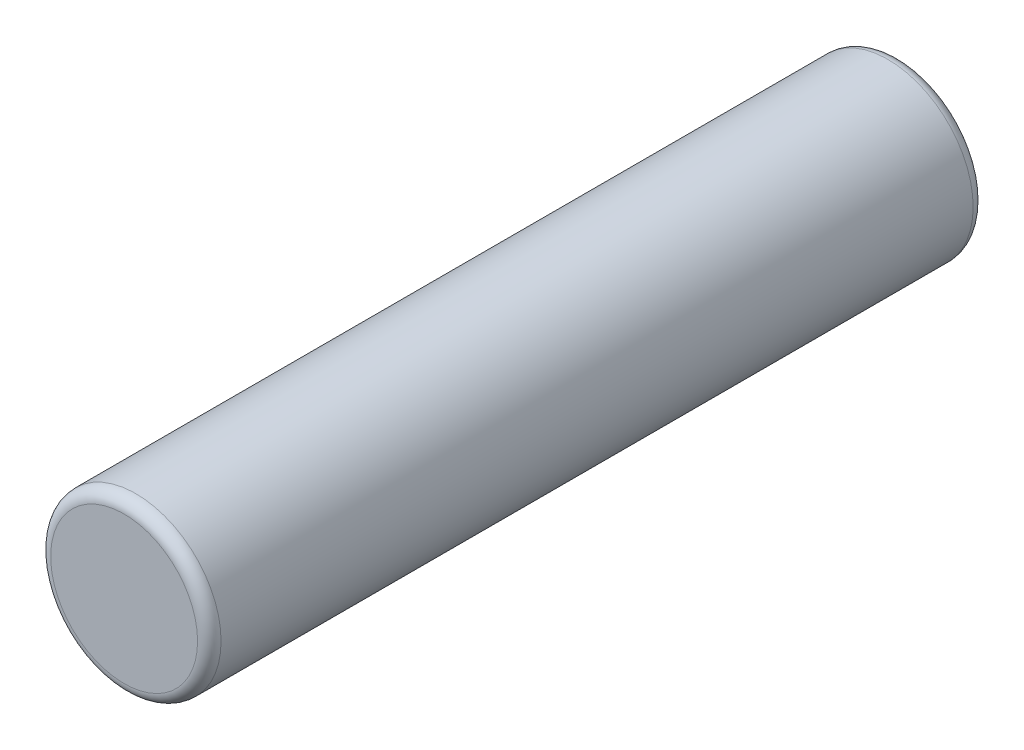
ISO-10303-21;
HEADER;
FILE_DESCRIPTION(('STEP AP214'),'2;1');
FILE_NAME('part.step','',(''),(''),'','','');
FILE_SCHEMA(('AUTOMOTIVE_DESIGN { 1 0 10303 214 1 1 1 1 }'));
ENDSEC;
DATA;
#1=APPLICATION_CONTEXT('core data for automotive mechanical design processes');
#2=APPLICATION_PROTOCOL_DEFINITION('international standard','automotive_design',2000,#1);
#3=PRODUCT_CONTEXT('',#1,'mechanical');
#4=PRODUCT('Part','Part','',(#3));
#5=PRODUCT_RELATED_PRODUCT_CATEGORY('part','',(#4));
#6=PRODUCT_DEFINITION_FORMATION('','',#4);
#7=PRODUCT_DEFINITION_CONTEXT('part definition',#1,'design');
#8=PRODUCT_DEFINITION('design','',#6,#7);
#9=PRODUCT_DEFINITION_SHAPE('','',#8);
#10=(LENGTH_UNIT() NAMED_UNIT(*) SI_UNIT(.MILLI.,.METRE.));
#11=(NAMED_UNIT(*) PLANE_ANGLE_UNIT() SI_UNIT($,.RADIAN.));
#12=(NAMED_UNIT(*) SI_UNIT($,.STERADIAN.) SOLID_ANGLE_UNIT());
#13=UNCERTAINTY_MEASURE_WITH_UNIT(LENGTH_MEASURE(1.E-05),#10,'distance_accuracy_value','');
#14=(GEOMETRIC_REPRESENTATION_CONTEXT(3) GLOBAL_UNCERTAINTY_ASSIGNED_CONTEXT((#13)) GLOBAL_UNIT_ASSIGNED_CONTEXT((#10,
#11,#12)) REPRESENTATION_CONTEXT('',''));
#15=CARTESIAN_POINT('',(0.,0.,0.));
#16=DIRECTION('',(0.,0.,1.));
#17=DIRECTION('',(1.,0.,0.));
#18=AXIS2_PLACEMENT_3D('',#15,#16,#17);
#19=CARTESIAN_POINT('',(0.,0.,33.));
#20=DIRECTION('',(0.,0.,-1.));
#21=DIRECTION('',(-1.,0.,0.));
#22=AXIS2_PLACEMENT_3D('',#19,#20,#21);
#23=CYLINDRICAL_SURFACE('',#22,7.25);
#24=CARTESIAN_POINT('',(0.,0.,-32.));
#25=DIRECTION('',(0.,0.,1.));
#26=DIRECTION('',(1.,0.,0.));
#27=AXIS2_PLACEMENT_3D('',#24,#25,#26);
#28=CIRCLE('',#27,7.25);
#29=CARTESIAN_POINT('',(7.25,0.,-32.));
#30=VERTEX_POINT('',#29);
#31=EDGE_CURVE('E43',#30,#30,#28,.T.);
#32=ORIENTED_EDGE('',*,*,#31,.T.);
#33=EDGE_LOOP('',(#32));
#34=FACE_BOUND('',#33,.T.);
#35=CARTESIAN_POINT('',(0.,0.,32.));
#36=DIRECTION('',(0.,0.,1.));
#37=DIRECTION('',(1.,0.,0.));
#38=AXIS2_PLACEMENT_3D('',#35,#36,#37);
#39=CIRCLE('',#38,7.25);
#40=CARTESIAN_POINT('',(7.25,0.,32.));
#41=VERTEX_POINT('',#40);
#42=EDGE_CURVE('E47',#41,#41,#39,.F.);
#43=ORIENTED_EDGE('',*,*,#42,.T.);
#44=EDGE_LOOP('',(#43));
#45=FACE_BOUND('',#44,.T.);
#46=ADVANCED_FACE('F32',(#34,#45),#23,.T.);
#47=CARTESIAN_POINT('',(0.,0.,33.));
#48=DIRECTION('',(0.,0.,1.));
#49=DIRECTION('',(1.,0.,0.));
#50=AXIS2_PLACEMENT_3D('',#47,#48,#49);
#51=PLANE('',#50);
#52=CARTESIAN_POINT('',(0.,0.,33.));
#53=DIRECTION('',(0.,0.,1.));
#54=DIRECTION('',(1.,0.,0.));
#55=AXIS2_PLACEMENT_3D('',#52,#53,#54);
#56=CIRCLE('',#55,6.25);
#57=CARTESIAN_POINT('',(6.25,0.,33.));
#58=VERTEX_POINT('',#57);
#59=EDGE_CURVE('E10',#58,#58,#56,.T.);
#60=ORIENTED_EDGE('',*,*,#59,.T.);
#61=EDGE_LOOP('',(#60));
#62=FACE_BOUND('',#61,.T.);
#63=ADVANCED_FACE('F63',(#62),#51,.T.);
#64=CARTESIAN_POINT('',(0.,0.,-33.));
#65=DIRECTION('',(0.,0.,1.));
#66=DIRECTION('',(1.,0.,0.));
#67=AXIS2_PLACEMENT_3D('',#64,#65,#66);
#68=PLANE('',#67);
#69=CARTESIAN_POINT('',(0.,0.,-33.));
#70=DIRECTION('',(0.,0.,1.));
#71=DIRECTION('',(1.,0.,0.));
#72=AXIS2_PLACEMENT_3D('',#69,#70,#71);
#73=CIRCLE('',#72,6.25);
#74=CARTESIAN_POINT('',(6.25,0.,-33.));
#75=VERTEX_POINT('',#74);
#76=EDGE_CURVE('E39',#75,#75,#73,.F.);
#77=ORIENTED_EDGE('',*,*,#76,.T.);
#78=EDGE_LOOP('',(#77));
#79=FACE_BOUND('',#78,.T.);
#80=ADVANCED_FACE('F60',(#79),#68,.F.);
#81=CARTESIAN_POINT('',(0.,0.,-32.));
#82=DIRECTION('',(0.,0.,1.));
#83=DIRECTION('',(1.,0.,0.));
#84=AXIS2_PLACEMENT_3D('',#81,#82,#83);
#85=TOROIDAL_SURFACE('',#84,6.25,1.);
#86=ORIENTED_EDGE('',*,*,#76,.F.);
#87=EDGE_LOOP('',(#86));
#88=FACE_BOUND('',#87,.T.);
#89=ORIENTED_EDGE('',*,*,#31,.F.);
#90=EDGE_LOOP('',(#89));
#91=FACE_BOUND('',#90,.T.);
#92=ADVANCED_FACE('F56',(#88,#91),#85,.T.);
#93=CARTESIAN_POINT('',(0.,0.,32.));
#94=DIRECTION('',(0.,0.,1.));
#95=DIRECTION('',(1.,0.,0.));
#96=AXIS2_PLACEMENT_3D('',#93,#94,#95);
#97=TOROIDAL_SURFACE('',#96,6.25,1.);
#98=ORIENTED_EDGE('',*,*,#42,.F.);
#99=EDGE_LOOP('',(#98));
#100=FACE_BOUND('',#99,.T.);
#101=ORIENTED_EDGE('',*,*,#59,.F.);
#102=EDGE_LOOP('',(#101));
#103=FACE_BOUND('',#102,.T.);
#104=ADVANCED_FACE('F34',(#100,#103),#97,.T.);
#105=CLOSED_SHELL('',(#46,#63,#80,#92,#104));
#106=MANIFOLD_SOLID_BREP('B2',#105);
#107=ADVANCED_BREP_SHAPE_REPRESENTATION('',(#18,#106),#14);
#108=SHAPE_DEFINITION_REPRESENTATION(#9,#107);
ENDSEC;
END-ISO-10303-21;
